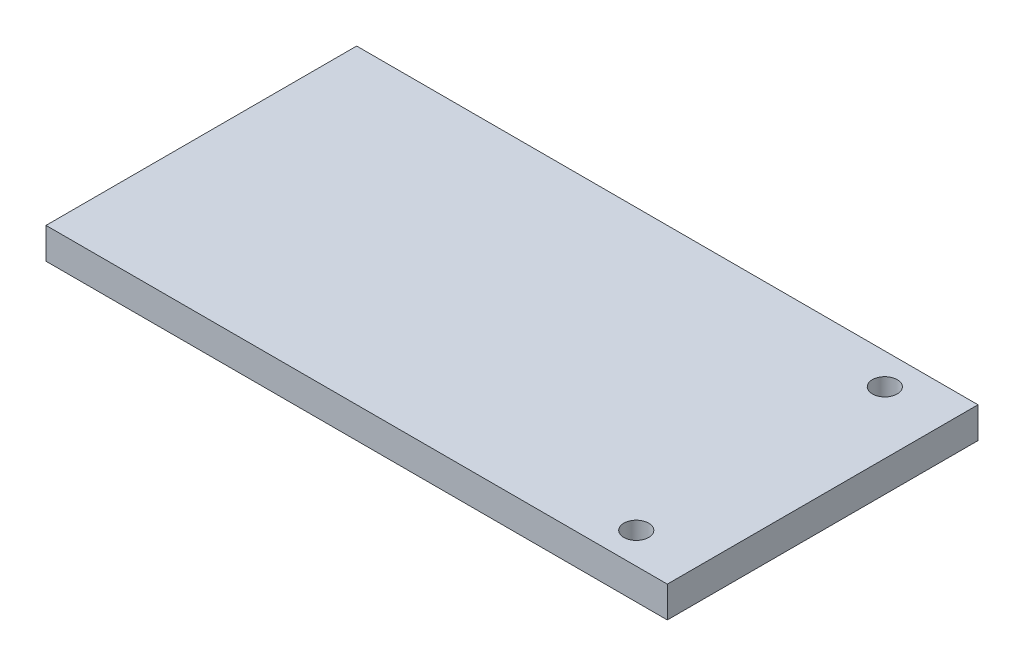
ISO-10303-21;
HEADER;
FILE_DESCRIPTION(('STEP AP214'),'2;1');
FILE_NAME('part.step','',(''),(''),'','','');
FILE_SCHEMA(('AUTOMOTIVE_DESIGN { 1 0 10303 214 1 1 1 1 }'));
ENDSEC;
DATA;
#1=APPLICATION_CONTEXT('core data for automotive mechanical design processes');
#2=APPLICATION_PROTOCOL_DEFINITION('international standard','automotive_design',2000,#1);
#3=PRODUCT_CONTEXT('',#1,'mechanical');
#4=PRODUCT('Part','Part','',(#3));
#5=PRODUCT_RELATED_PRODUCT_CATEGORY('part','',(#4));
#6=PRODUCT_DEFINITION_FORMATION('','',#4);
#7=PRODUCT_DEFINITION_CONTEXT('part definition',#1,'design');
#8=PRODUCT_DEFINITION('design','',#6,#7);
#9=PRODUCT_DEFINITION_SHAPE('','',#8);
#10=(LENGTH_UNIT() NAMED_UNIT(*) SI_UNIT(.MILLI.,.METRE.));
#11=(NAMED_UNIT(*) PLANE_ANGLE_UNIT() SI_UNIT($,.RADIAN.));
#12=(NAMED_UNIT(*) SI_UNIT($,.STERADIAN.) SOLID_ANGLE_UNIT());
#13=UNCERTAINTY_MEASURE_WITH_UNIT(LENGTH_MEASURE(1.E-05),#10,'distance_accuracy_value','');
#14=(GEOMETRIC_REPRESENTATION_CONTEXT(3) GLOBAL_UNCERTAINTY_ASSIGNED_CONTEXT((#13)) GLOBAL_UNIT_ASSIGNED_CONTEXT((#10,
#11,#12)) REPRESENTATION_CONTEXT('',''));
#15=CARTESIAN_POINT('',(0.,0.,0.));
#16=DIRECTION('',(0.,0.,1.));
#17=DIRECTION('',(1.,0.,0.));
#18=AXIS2_PLACEMENT_3D('',#15,#16,#17);
#19=CARTESIAN_POINT('',(50.,5.,0.));
#20=DIRECTION('',(1.,0.,0.));
#21=DIRECTION('',(0.,0.,-1.));
#22=AXIS2_PLACEMENT_3D('',#19,#20,#21);
#23=PLANE('',#22);
#24=DIRECTION('',(0.,0.,1.));
#25=VECTOR('',#24,1.);
#26=CARTESIAN_POINT('',(50.,0.,0.));
#27=LINE('',#26,#25);
#28=CARTESIAN_POINT('',(50.,0.,-25.));
#29=VERTEX_POINT('',#28);
#30=CARTESIAN_POINT('',(50.,0.,25.));
#31=VERTEX_POINT('',#30);
#32=EDGE_CURVE('E123',#29,#31,#27,.T.);
#33=ORIENTED_EDGE('',*,*,#32,.F.);
#34=DIRECTION('',(0.,-1.,0.));
#35=VECTOR('',#34,1.);
#36=CARTESIAN_POINT('',(50.,5.,-25.));
#37=LINE('',#36,#35);
#38=CARTESIAN_POINT('',(50.,5.,-25.));
#39=VERTEX_POINT('',#38);
#40=EDGE_CURVE('E11',#39,#29,#37,.T.);
#41=ORIENTED_EDGE('',*,*,#40,.F.);
#42=DIRECTION('',(0.,0.,1.));
#43=VECTOR('',#42,1.);
#44=CARTESIAN_POINT('',(50.,5.,0.));
#45=LINE('',#44,#43);
#46=CARTESIAN_POINT('',(50.,5.,25.));
#47=VERTEX_POINT('',#46);
#48=EDGE_CURVE('E105',#39,#47,#45,.T.);
#49=ORIENTED_EDGE('',*,*,#48,.T.);
#50=DIRECTION('',(0.,-1.,0.));
#51=VECTOR('',#50,1.);
#52=CARTESIAN_POINT('',(50.,5.,25.));
#53=LINE('',#52,#51);
#54=EDGE_CURVE('E82',#47,#31,#53,.T.);
#55=ORIENTED_EDGE('',*,*,#54,.T.);
#56=EDGE_LOOP('',(#33,#41,#49,#55));
#57=FACE_BOUND('',#56,.T.);
#58=ADVANCED_FACE('F41',(#57),#23,.T.);
#59=CARTESIAN_POINT('',(0.,5.,-25.));
#60=DIRECTION('',(0.,0.,-1.));
#61=DIRECTION('',(-1.,0.,0.));
#62=AXIS2_PLACEMENT_3D('',#59,#60,#61);
#63=PLANE('',#62);
#64=DIRECTION('',(1.,0.,0.));
#65=VECTOR('',#64,1.);
#66=CARTESIAN_POINT('',(0.,0.,-25.));
#67=LINE('',#66,#65);
#68=CARTESIAN_POINT('',(-50.,0.,-25.));
#69=VERTEX_POINT('',#68);
#70=EDGE_CURVE('E94',#69,#29,#67,.T.);
#71=ORIENTED_EDGE('',*,*,#70,.F.);
#72=DIRECTION('',(0.,-1.,0.));
#73=VECTOR('',#72,1.);
#74=CARTESIAN_POINT('',(-50.,5.,-25.));
#75=LINE('',#74,#73);
#76=CARTESIAN_POINT('',(-50.,5.,-25.));
#77=VERTEX_POINT('',#76);
#78=EDGE_CURVE('E51',#77,#69,#75,.T.);
#79=ORIENTED_EDGE('',*,*,#78,.F.);
#80=DIRECTION('',(1.,0.,0.));
#81=VECTOR('',#80,1.);
#82=CARTESIAN_POINT('',(0.,5.,-25.));
#83=LINE('',#82,#81);
#84=EDGE_CURVE('E92',#77,#39,#83,.T.);
#85=ORIENTED_EDGE('',*,*,#84,.T.);
#86=ORIENTED_EDGE('',*,*,#40,.T.);
#87=EDGE_LOOP('',(#71,#79,#85,#86));
#88=FACE_BOUND('',#87,.T.);
#89=ADVANCED_FACE('F90',(#88),#63,.T.);
#90=CARTESIAN_POINT('',(-50.,5.,0.));
#91=DIRECTION('',(1.,0.,0.));
#92=DIRECTION('',(0.,0.,-1.));
#93=AXIS2_PLACEMENT_3D('',#90,#91,#92);
#94=PLANE('',#93);
#95=DIRECTION('',(0.,0.,1.));
#96=VECTOR('',#95,1.);
#97=CARTESIAN_POINT('',(-50.,0.,0.));
#98=LINE('',#97,#96);
#99=CARTESIAN_POINT('',(-50.,0.,25.));
#100=VERTEX_POINT('',#99);
#101=EDGE_CURVE('E128',#69,#100,#98,.T.);
#102=ORIENTED_EDGE('',*,*,#101,.T.);
#103=DIRECTION('',(0.,-1.,0.));
#104=VECTOR('',#103,1.);
#105=CARTESIAN_POINT('',(-50.,5.,25.));
#106=LINE('',#105,#104);
#107=CARTESIAN_POINT('',(-50.,5.,25.));
#108=VERTEX_POINT('',#107);
#109=EDGE_CURVE('E98',#108,#100,#106,.T.);
#110=ORIENTED_EDGE('',*,*,#109,.F.);
#111=DIRECTION('',(0.,0.,1.));
#112=VECTOR('',#111,1.);
#113=CARTESIAN_POINT('',(-50.,5.,0.));
#114=LINE('',#113,#112);
#115=EDGE_CURVE('E100',#77,#108,#114,.T.);
#116=ORIENTED_EDGE('',*,*,#115,.F.);
#117=ORIENTED_EDGE('',*,*,#78,.T.);
#118=EDGE_LOOP('',(#102,#110,#116,#117));
#119=FACE_BOUND('',#118,.T.);
#120=ADVANCED_FACE('F101',(#119),#94,.F.);
#121=CARTESIAN_POINT('',(40.,5.,-20.));
#122=DIRECTION('',(0.,-1.,0.));
#123=DIRECTION('',(0.,0.,-1.));
#124=AXIS2_PLACEMENT_3D('',#121,#122,#123);
#125=CYLINDRICAL_SURFACE('',#124,2.);
#126=CARTESIAN_POINT('',(40.,5.,-20.));
#127=DIRECTION('',(0.,1.,0.));
#128=DIRECTION('',(0.,0.,1.));
#129=AXIS2_PLACEMENT_3D('',#126,#127,#128);
#130=CIRCLE('',#129,2.);
#131=CARTESIAN_POINT('',(40.,5.,-18.));
#132=VERTEX_POINT('',#131);
#133=EDGE_CURVE('E109',#132,#132,#130,.T.);
#134=ORIENTED_EDGE('',*,*,#133,.T.);
#135=EDGE_LOOP('',(#134));
#136=FACE_BOUND('',#135,.T.);
#137=CARTESIAN_POINT('',(40.,0.,-20.));
#138=DIRECTION('',(0.,1.,0.));
#139=DIRECTION('',(0.,0.,1.));
#140=AXIS2_PLACEMENT_3D('',#137,#138,#139);
#141=CIRCLE('',#140,2.);
#142=CARTESIAN_POINT('',(40.,0.,-18.));
#143=VERTEX_POINT('',#142);
#144=EDGE_CURVE('E119',#143,#143,#141,.T.);
#145=ORIENTED_EDGE('',*,*,#144,.F.);
#146=EDGE_LOOP('',(#145));
#147=FACE_BOUND('',#146,.T.);
#148=ADVANCED_FACE('F147',(#136,#147),#125,.F.);
#149=CARTESIAN_POINT('',(40.,5.,20.));
#150=DIRECTION('',(0.,-1.,0.));
#151=DIRECTION('',(0.,0.,-1.));
#152=AXIS2_PLACEMENT_3D('',#149,#150,#151);
#153=CYLINDRICAL_SURFACE('',#152,2.);
#154=CARTESIAN_POINT('',(40.,5.,20.));
#155=DIRECTION('',(0.,1.,0.));
#156=DIRECTION('',(0.,0.,1.));
#157=AXIS2_PLACEMENT_3D('',#154,#155,#156);
#158=CIRCLE('',#157,2.);
#159=CARTESIAN_POINT('',(40.,5.,22.));
#160=VERTEX_POINT('',#159);
#161=EDGE_CURVE('E133',#160,#160,#158,.T.);
#162=ORIENTED_EDGE('',*,*,#161,.T.);
#163=EDGE_LOOP('',(#162));
#164=FACE_BOUND('',#163,.T.);
#165=CARTESIAN_POINT('',(40.,0.,20.));
#166=DIRECTION('',(0.,1.,0.));
#167=DIRECTION('',(0.,0.,1.));
#168=AXIS2_PLACEMENT_3D('',#165,#166,#167);
#169=CIRCLE('',#168,2.);
#170=CARTESIAN_POINT('',(40.,0.,22.));
#171=VERTEX_POINT('',#170);
#172=EDGE_CURVE('E115',#171,#171,#169,.T.);
#173=ORIENTED_EDGE('',*,*,#172,.F.);
#174=EDGE_LOOP('',(#173));
#175=FACE_BOUND('',#174,.T.);
#176=ADVANCED_FACE('F43',(#164,#175),#153,.F.);
#177=CARTESIAN_POINT('',(0.,5.,25.));
#178=DIRECTION('',(0.,0.,-1.));
#179=DIRECTION('',(-1.,0.,0.));
#180=AXIS2_PLACEMENT_3D('',#177,#178,#179);
#181=PLANE('',#180);
#182=DIRECTION('',(1.,0.,0.));
#183=VECTOR('',#182,1.);
#184=CARTESIAN_POINT('',(0.,0.,25.));
#185=LINE('',#184,#183);
#186=EDGE_CURVE('E75',#100,#31,#185,.T.);
#187=ORIENTED_EDGE('',*,*,#186,.T.);
#188=ORIENTED_EDGE('',*,*,#54,.F.);
#189=DIRECTION('',(1.,0.,0.));
#190=VECTOR('',#189,1.);
#191=CARTESIAN_POINT('',(0.,5.,25.));
#192=LINE('',#191,#190);
#193=EDGE_CURVE('E59',#108,#47,#192,.T.);
#194=ORIENTED_EDGE('',*,*,#193,.F.);
#195=ORIENTED_EDGE('',*,*,#109,.T.);
#196=EDGE_LOOP('',(#187,#188,#194,#195));
#197=FACE_BOUND('',#196,.T.);
#198=ADVANCED_FACE('F138',(#197),#181,.F.);
#199=CARTESIAN_POINT('',(0.,5.,0.));
#200=DIRECTION('',(0.,1.,0.));
#201=DIRECTION('',(0.,0.,1.));
#202=AXIS2_PLACEMENT_3D('',#199,#200,#201);
#203=PLANE('',#202);
#204=ORIENTED_EDGE('',*,*,#161,.F.);
#205=EDGE_LOOP('',(#204));
#206=FACE_BOUND('',#205,.T.);
#207=ORIENTED_EDGE('',*,*,#133,.F.);
#208=EDGE_LOOP('',(#207));
#209=FACE_BOUND('',#208,.T.);
#210=ORIENTED_EDGE('',*,*,#48,.F.);
#211=ORIENTED_EDGE('',*,*,#84,.F.);
#212=ORIENTED_EDGE('',*,*,#115,.T.);
#213=ORIENTED_EDGE('',*,*,#193,.T.);
#214=EDGE_LOOP('',(#210,#211,#212,#213));
#215=FACE_BOUND('',#214,.T.);
#216=ADVANCED_FACE('F104',(#206,#209,#215),#203,.T.);
#217=CARTESIAN_POINT('',(0.,0.,0.));
#218=DIRECTION('',(0.,1.,0.));
#219=DIRECTION('',(0.,0.,1.));
#220=AXIS2_PLACEMENT_3D('',#217,#218,#219);
#221=PLANE('',#220);
#222=ORIENTED_EDGE('',*,*,#172,.T.);
#223=EDGE_LOOP('',(#222));
#224=FACE_BOUND('',#223,.T.);
#225=ORIENTED_EDGE('',*,*,#144,.T.);
#226=EDGE_LOOP('',(#225));
#227=FACE_BOUND('',#226,.T.);
#228=ORIENTED_EDGE('',*,*,#32,.T.);
#229=ORIENTED_EDGE('',*,*,#186,.F.);
#230=ORIENTED_EDGE('',*,*,#101,.F.);
#231=ORIENTED_EDGE('',*,*,#70,.T.);
#232=EDGE_LOOP('',(#228,#229,#230,#231));
#233=FACE_BOUND('',#232,.T.);
#234=ADVANCED_FACE('F139',(#224,#227,#233),#221,.F.);
#235=CLOSED_SHELL('',(#58,#89,#120,#148,#176,#198,#216,#234));
#236=MANIFOLD_SOLID_BREP('B2',#235);
#237=ADVANCED_BREP_SHAPE_REPRESENTATION('',(#18,#236),#14);
#238=SHAPE_DEFINITION_REPRESENTATION(#9,#237);
ENDSEC;
END-ISO-10303-21;
